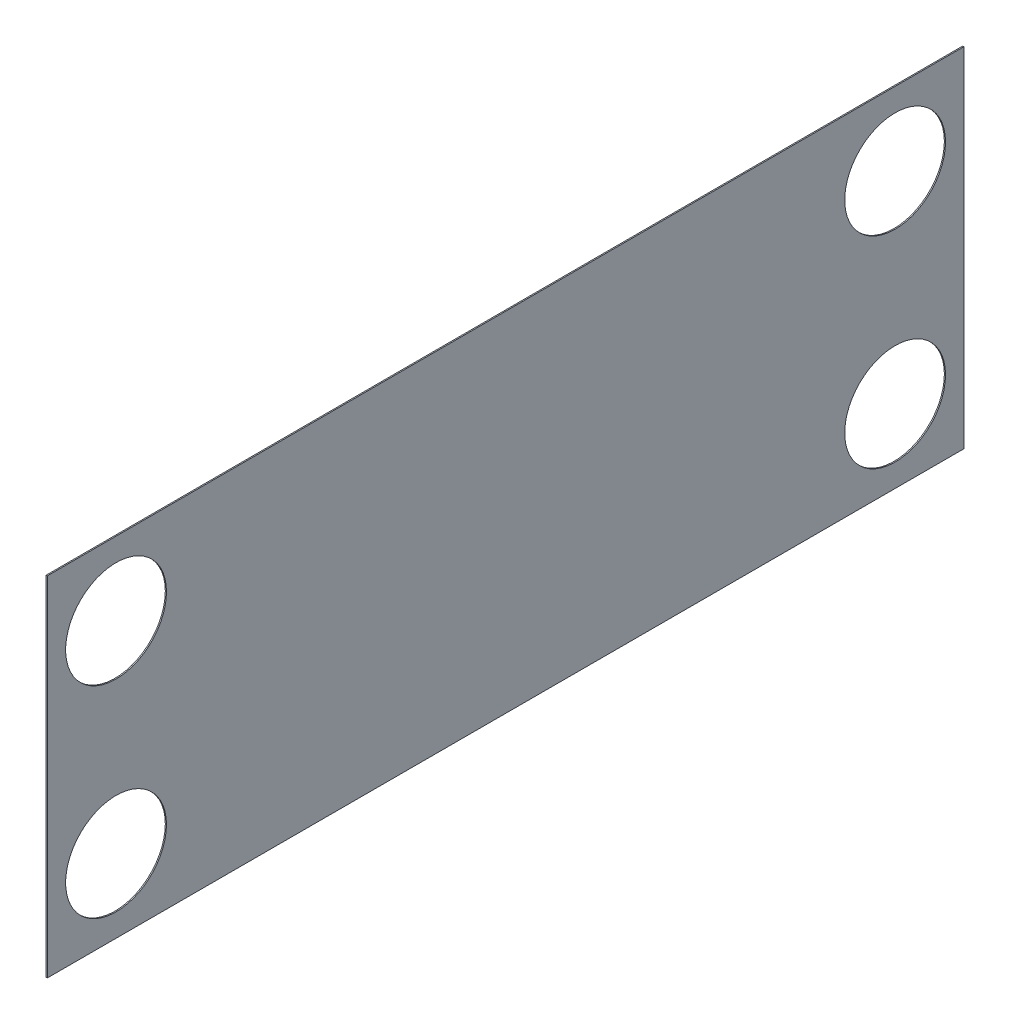
ISO-10303-21;
HEADER;
FILE_DESCRIPTION(('STEP AP214'),'2;1');
FILE_NAME('part.step','',(''),(''),'','','');
FILE_SCHEMA(('AUTOMOTIVE_DESIGN { 1 0 10303 214 1 1 1 1 }'));
ENDSEC;
DATA;
#1=APPLICATION_CONTEXT('core data for automotive mechanical design processes');
#2=APPLICATION_PROTOCOL_DEFINITION('international standard','automotive_design',2000,#1);
#3=PRODUCT_CONTEXT('',#1,'mechanical');
#4=PRODUCT('Part','Part','',(#3));
#5=PRODUCT_RELATED_PRODUCT_CATEGORY('part','',(#4));
#6=PRODUCT_DEFINITION_FORMATION('','',#4);
#7=PRODUCT_DEFINITION_CONTEXT('part definition',#1,'design');
#8=PRODUCT_DEFINITION('design','',#6,#7);
#9=PRODUCT_DEFINITION_SHAPE('','',#8);
#10=(LENGTH_UNIT() NAMED_UNIT(*) SI_UNIT(.MILLI.,.METRE.));
#11=(NAMED_UNIT(*) PLANE_ANGLE_UNIT() SI_UNIT($,.RADIAN.));
#12=(NAMED_UNIT(*) SI_UNIT($,.STERADIAN.) SOLID_ANGLE_UNIT());
#13=UNCERTAINTY_MEASURE_WITH_UNIT(LENGTH_MEASURE(1.E-05),#10,'distance_accuracy_value','');
#14=(GEOMETRIC_REPRESENTATION_CONTEXT(3) GLOBAL_UNCERTAINTY_ASSIGNED_CONTEXT((#13)) GLOBAL_UNIT_ASSIGNED_CONTEXT((#10,
#11,#12)) REPRESENTATION_CONTEXT('',''));
#15=CARTESIAN_POINT('',(0.,0.,0.));
#16=DIRECTION('',(0.,0.,1.));
#17=DIRECTION('',(1.,0.,0.));
#18=AXIS2_PLACEMENT_3D('',#15,#16,#17);
#19=CARTESIAN_POINT('',(0.127,19.,50.));
#20=DIRECTION('',(0.,0.,-1.));
#21=DIRECTION('',(-1.,0.,0.));
#22=AXIS2_PLACEMENT_3D('',#19,#20,#21);
#23=PLANE('',#22);
#24=DIRECTION('',(0.,-1.,0.));
#25=VECTOR('',#24,1.);
#26=CARTESIAN_POINT('',(0.,19.,50.));
#27=LINE('',#26,#25);
#28=CARTESIAN_POINT('',(0.,19.,50.));
#29=VERTEX_POINT('',#28);
#30=CARTESIAN_POINT('',(0.,-19.,50.));
#31=VERTEX_POINT('',#30);
#32=EDGE_CURVE('E97',#29,#31,#27,.T.);
#33=ORIENTED_EDGE('',*,*,#32,.T.);
#34=DIRECTION('',(-1.,0.,0.));
#35=VECTOR('',#34,1.);
#36=CARTESIAN_POINT('',(0.127,-19.,50.));
#37=LINE('',#36,#35);
#38=CARTESIAN_POINT('',(0.127,-19.,50.));
#39=VERTEX_POINT('',#38);
#40=EDGE_CURVE('E11',#39,#31,#37,.T.);
#41=ORIENTED_EDGE('',*,*,#40,.F.);
#42=DIRECTION('',(0.,-1.,0.));
#43=VECTOR('',#42,1.);
#44=CARTESIAN_POINT('',(0.127,19.,50.));
#45=LINE('',#44,#43);
#46=CARTESIAN_POINT('',(0.127,19.,50.));
#47=VERTEX_POINT('',#46);
#48=EDGE_CURVE('E85',#47,#39,#45,.T.);
#49=ORIENTED_EDGE('',*,*,#48,.F.);
#50=DIRECTION('',(-1.,0.,0.));
#51=VECTOR('',#50,1.);
#52=CARTESIAN_POINT('',(0.127,19.,50.));
#53=LINE('',#52,#51);
#54=EDGE_CURVE('E93',#47,#29,#53,.T.);
#55=ORIENTED_EDGE('',*,*,#54,.T.);
#56=EDGE_LOOP('',(#33,#41,#49,#55));
#57=FACE_BOUND('',#56,.T.);
#58=ADVANCED_FACE('F34',(#57),#23,.F.);
#59=CARTESIAN_POINT('',(0.127,-19.,50.));
#60=DIRECTION('',(0.,1.,0.));
#61=DIRECTION('',(0.,0.,1.));
#62=AXIS2_PLACEMENT_3D('',#59,#60,#61);
#63=PLANE('',#62);
#64=DIRECTION('',(0.,0.,-1.));
#65=VECTOR('',#64,1.);
#66=CARTESIAN_POINT('',(0.,-19.,50.));
#67=LINE('',#66,#65);
#68=CARTESIAN_POINT('',(0.,-19.,-50.));
#69=VERTEX_POINT('',#68);
#70=EDGE_CURVE('E89',#31,#69,#67,.T.);
#71=ORIENTED_EDGE('',*,*,#70,.T.);
#72=DIRECTION('',(-1.,0.,0.));
#73=VECTOR('',#72,1.);
#74=CARTESIAN_POINT('',(0.127,-19.,-50.));
#75=LINE('',#74,#73);
#76=CARTESIAN_POINT('',(0.127,-19.,-50.));
#77=VERTEX_POINT('',#76);
#78=EDGE_CURVE('E42',#77,#69,#75,.T.);
#79=ORIENTED_EDGE('',*,*,#78,.F.);
#80=DIRECTION('',(0.,0.,-1.));
#81=VECTOR('',#80,1.);
#82=CARTESIAN_POINT('',(0.127,-19.,50.));
#83=LINE('',#82,#81);
#84=EDGE_CURVE('E80',#39,#77,#83,.T.);
#85=ORIENTED_EDGE('',*,*,#84,.F.);
#86=ORIENTED_EDGE('',*,*,#40,.T.);
#87=EDGE_LOOP('',(#71,#79,#85,#86));
#88=FACE_BOUND('',#87,.T.);
#89=ADVANCED_FACE('F88',(#88),#63,.F.);
#90=CARTESIAN_POINT('',(0.127,19.,-50.));
#91=DIRECTION('',(0.,0.,1.));
#92=DIRECTION('',(1.,0.,0.));
#93=AXIS2_PLACEMENT_3D('',#90,#91,#92);
#94=PLANE('',#93);
#95=DIRECTION('',(0.,1.,0.));
#96=VECTOR('',#95,1.);
#97=CARTESIAN_POINT('',(0.,19.,-50.));
#98=LINE('',#97,#96);
#99=CARTESIAN_POINT('',(0.,19.,-50.));
#100=VERTEX_POINT('',#99);
#101=EDGE_CURVE('E67',#69,#100,#98,.T.);
#102=ORIENTED_EDGE('',*,*,#101,.T.);
#103=DIRECTION('',(-1.,0.,0.));
#104=VECTOR('',#103,1.);
#105=CARTESIAN_POINT('',(0.127,19.,-50.));
#106=LINE('',#105,#104);
#107=CARTESIAN_POINT('',(0.127,19.,-50.));
#108=VERTEX_POINT('',#107);
#109=EDGE_CURVE('E90',#108,#100,#106,.T.);
#110=ORIENTED_EDGE('',*,*,#109,.F.);
#111=DIRECTION('',(0.,1.,0.));
#112=VECTOR('',#111,1.);
#113=CARTESIAN_POINT('',(0.127,19.,-50.));
#114=LINE('',#113,#112);
#115=EDGE_CURVE('E83',#77,#108,#114,.T.);
#116=ORIENTED_EDGE('',*,*,#115,.F.);
#117=ORIENTED_EDGE('',*,*,#78,.T.);
#118=EDGE_LOOP('',(#102,#110,#116,#117));
#119=FACE_BOUND('',#118,.T.);
#120=ADVANCED_FACE('F91',(#119),#94,.F.);
#121=CARTESIAN_POINT('',(0.127,19.,50.));
#122=DIRECTION('',(0.,-1.,0.));
#123=DIRECTION('',(0.,0.,-1.));
#124=AXIS2_PLACEMENT_3D('',#121,#122,#123);
#125=PLANE('',#124);
#126=DIRECTION('',(0.,0.,1.));
#127=VECTOR('',#126,1.);
#128=CARTESIAN_POINT('',(0.,19.,50.));
#129=LINE('',#128,#127);
#130=EDGE_CURVE('E73',#100,#29,#129,.T.);
#131=ORIENTED_EDGE('',*,*,#130,.T.);
#132=ORIENTED_EDGE('',*,*,#54,.F.);
#133=DIRECTION('',(0.,0.,1.));
#134=VECTOR('',#133,1.);
#135=CARTESIAN_POINT('',(0.127,19.,50.));
#136=LINE('',#135,#134);
#137=EDGE_CURVE('E50',#108,#47,#136,.T.);
#138=ORIENTED_EDGE('',*,*,#137,.F.);
#139=ORIENTED_EDGE('',*,*,#109,.T.);
#140=EDGE_LOOP('',(#131,#132,#138,#139));
#141=FACE_BOUND('',#140,.T.);
#142=ADVANCED_FACE('F105',(#141),#125,.F.);
#143=CARTESIAN_POINT('',(0.127,0.,0.));
#144=DIRECTION('',(1.,0.,0.));
#145=DIRECTION('',(0.,0.,-1.));
#146=AXIS2_PLACEMENT_3D('',#143,#144,#145);
#147=PLANE('',#146);
#148=CARTESIAN_POINT('',(0.127000000000001,11.,42.5));
#149=DIRECTION('',(1.,0.,0.));
#150=DIRECTION('',(0.,0.,-1.));
#151=AXIS2_PLACEMENT_3D('',#148,#149,#150);
#152=CIRCLE('',#151,5.49999999999999);
#153=CARTESIAN_POINT('',(0.127000000000001,11.,37.));
#154=VERTEX_POINT('',#153);
#155=EDGE_CURVE('E131',#154,#154,#152,.T.);
#156=ORIENTED_EDGE('',*,*,#155,.F.);
#157=EDGE_LOOP('',(#156));
#158=FACE_BOUND('',#157,.T.);
#159=CARTESIAN_POINT('',(0.127000000000001,-11.,42.5));
#160=DIRECTION('',(1.,0.,0.));
#161=DIRECTION('',(0.,0.,-1.));
#162=AXIS2_PLACEMENT_3D('',#159,#160,#161);
#163=CIRCLE('',#162,5.49999999999999);
#164=CARTESIAN_POINT('',(0.127000000000001,-11.,37.));
#165=VERTEX_POINT('',#164);
#166=EDGE_CURVE('E125',#165,#165,#163,.T.);
#167=ORIENTED_EDGE('',*,*,#166,.F.);
#168=EDGE_LOOP('',(#167));
#169=FACE_BOUND('',#168,.T.);
#170=CARTESIAN_POINT('',(0.127000000000001,11.,-42.5));
#171=DIRECTION('',(1.,0.,0.));
#172=DIRECTION('',(0.,0.,-1.));
#173=AXIS2_PLACEMENT_3D('',#170,#171,#172);
#174=CIRCLE('',#173,5.49999999999999);
#175=CARTESIAN_POINT('',(0.127000000000001,11.,-48.));
#176=VERTEX_POINT('',#175);
#177=EDGE_CURVE('E119',#176,#176,#174,.T.);
#178=ORIENTED_EDGE('',*,*,#177,.F.);
#179=EDGE_LOOP('',(#178));
#180=FACE_BOUND('',#179,.T.);
#181=CARTESIAN_POINT('',(0.127000000000001,-11.,-42.5));
#182=DIRECTION('',(1.,0.,0.));
#183=DIRECTION('',(0.,0.,-1.));
#184=AXIS2_PLACEMENT_3D('',#181,#182,#183);
#185=CIRCLE('',#184,5.49999999999999);
#186=CARTESIAN_POINT('',(0.127000000000001,-11.,-48.));
#187=VERTEX_POINT('',#186);
#188=EDGE_CURVE('E113',#187,#187,#185,.T.);
#189=ORIENTED_EDGE('',*,*,#188,.F.);
#190=EDGE_LOOP('',(#189));
#191=FACE_BOUND('',#190,.T.);
#192=ORIENTED_EDGE('',*,*,#48,.T.);
#193=ORIENTED_EDGE('',*,*,#84,.T.);
#194=ORIENTED_EDGE('',*,*,#115,.T.);
#195=ORIENTED_EDGE('',*,*,#137,.T.);
#196=EDGE_LOOP('',(#192,#193,#194,#195));
#197=FACE_BOUND('',#196,.T.);
#198=ADVANCED_FACE('F81',(#158,#169,#180,#191,#197),#147,.T.);
#199=CARTESIAN_POINT('',(0.,0.,0.));
#200=DIRECTION('',(1.,0.,0.));
#201=DIRECTION('',(0.,0.,-1.));
#202=AXIS2_PLACEMENT_3D('',#199,#200,#201);
#203=PLANE('',#202);
#204=CARTESIAN_POINT('',(0.,11.,42.5));
#205=DIRECTION('',(1.,0.,0.));
#206=DIRECTION('',(0.,0.,-1.));
#207=AXIS2_PLACEMENT_3D('',#204,#205,#206);
#208=CIRCLE('',#207,5.5);
#209=CARTESIAN_POINT('',(0.,11.,37.));
#210=VERTEX_POINT('',#209);
#211=EDGE_CURVE('E128',#210,#210,#208,.T.);
#212=ORIENTED_EDGE('',*,*,#211,.T.);
#213=EDGE_LOOP('',(#212));
#214=FACE_BOUND('',#213,.T.);
#215=CARTESIAN_POINT('',(0.,-11.,42.5));
#216=DIRECTION('',(1.,0.,0.));
#217=DIRECTION('',(0.,0.,-1.));
#218=AXIS2_PLACEMENT_3D('',#215,#216,#217);
#219=CIRCLE('',#218,5.5);
#220=CARTESIAN_POINT('',(0.,-11.,37.));
#221=VERTEX_POINT('',#220);
#222=EDGE_CURVE('E122',#221,#221,#219,.T.);
#223=ORIENTED_EDGE('',*,*,#222,.T.);
#224=EDGE_LOOP('',(#223));
#225=FACE_BOUND('',#224,.T.);
#226=CARTESIAN_POINT('',(0.,11.,-42.5));
#227=DIRECTION('',(1.,0.,0.));
#228=DIRECTION('',(0.,0.,-1.));
#229=AXIS2_PLACEMENT_3D('',#226,#227,#228);
#230=CIRCLE('',#229,5.5);
#231=CARTESIAN_POINT('',(0.,11.,-48.));
#232=VERTEX_POINT('',#231);
#233=EDGE_CURVE('E116',#232,#232,#230,.T.);
#234=ORIENTED_EDGE('',*,*,#233,.T.);
#235=EDGE_LOOP('',(#234));
#236=FACE_BOUND('',#235,.T.);
#237=CARTESIAN_POINT('',(0.,-11.,-42.5));
#238=DIRECTION('',(1.,0.,0.));
#239=DIRECTION('',(0.,0.,-1.));
#240=AXIS2_PLACEMENT_3D('',#237,#238,#239);
#241=CIRCLE('',#240,5.5);
#242=CARTESIAN_POINT('',(0.,-11.,-48.));
#243=VERTEX_POINT('',#242);
#244=EDGE_CURVE('E100',#243,#243,#241,.T.);
#245=ORIENTED_EDGE('',*,*,#244,.T.);
#246=EDGE_LOOP('',(#245));
#247=FACE_BOUND('',#246,.T.);
#248=ORIENTED_EDGE('',*,*,#32,.F.);
#249=ORIENTED_EDGE('',*,*,#130,.F.);
#250=ORIENTED_EDGE('',*,*,#101,.F.);
#251=ORIENTED_EDGE('',*,*,#70,.F.);
#252=EDGE_LOOP('',(#248,#249,#250,#251));
#253=FACE_BOUND('',#252,.T.);
#254=ADVANCED_FACE('F108',(#214,#225,#236,#247,#253),#203,.F.);
#255=CARTESIAN_POINT('',(0.127,-11.,-42.5));
#256=DIRECTION('',(1.,0.,0.));
#257=DIRECTION('',(0.,0.,-1.));
#258=AXIS2_PLACEMENT_3D('',#255,#256,#257);
#259=CYLINDRICAL_SURFACE('',#258,5.49999999999999);
#260=ORIENTED_EDGE('',*,*,#244,.F.);
#261=EDGE_LOOP('',(#260));
#262=FACE_BOUND('',#261,.T.);
#263=ORIENTED_EDGE('',*,*,#188,.T.);
#264=EDGE_LOOP('',(#263));
#265=FACE_BOUND('',#264,.T.);
#266=ADVANCED_FACE('F146',(#262,#265),#259,.F.);
#267=CARTESIAN_POINT('',(0.127,11.,-42.5));
#268=DIRECTION('',(1.,0.,0.));
#269=DIRECTION('',(0.,0.,-1.));
#270=AXIS2_PLACEMENT_3D('',#267,#268,#269);
#271=CYLINDRICAL_SURFACE('',#270,5.49999999999999);
#272=ORIENTED_EDGE('',*,*,#233,.F.);
#273=EDGE_LOOP('',(#272));
#274=FACE_BOUND('',#273,.T.);
#275=ORIENTED_EDGE('',*,*,#177,.T.);
#276=EDGE_LOOP('',(#275));
#277=FACE_BOUND('',#276,.T.);
#278=ADVANCED_FACE('F148',(#274,#277),#271,.F.);
#279=CARTESIAN_POINT('',(0.127,-11.,42.5));
#280=DIRECTION('',(1.,0.,0.));
#281=DIRECTION('',(0.,0.,-1.));
#282=AXIS2_PLACEMENT_3D('',#279,#280,#281);
#283=CYLINDRICAL_SURFACE('',#282,5.49999999999999);
#284=ORIENTED_EDGE('',*,*,#222,.F.);
#285=EDGE_LOOP('',(#284));
#286=FACE_BOUND('',#285,.T.);
#287=ORIENTED_EDGE('',*,*,#166,.T.);
#288=EDGE_LOOP('',(#287));
#289=FACE_BOUND('',#288,.T.);
#290=ADVANCED_FACE('F155',(#286,#289),#283,.F.);
#291=CARTESIAN_POINT('',(0.127,11.,42.5));
#292=DIRECTION('',(1.,0.,0.));
#293=DIRECTION('',(0.,0.,-1.));
#294=AXIS2_PLACEMENT_3D('',#291,#292,#293);
#295=CYLINDRICAL_SURFACE('',#294,5.49999999999999);
#296=ORIENTED_EDGE('',*,*,#211,.F.);
#297=EDGE_LOOP('',(#296));
#298=FACE_BOUND('',#297,.T.);
#299=ORIENTED_EDGE('',*,*,#155,.T.);
#300=EDGE_LOOP('',(#299));
#301=FACE_BOUND('',#300,.T.);
#302=ADVANCED_FACE('F135',(#298,#301),#295,.F.);
#303=CLOSED_SHELL('',(#58,#89,#120,#142,#198,#254,#266,#278,#290,#302));
#304=MANIFOLD_SOLID_BREP('B2',#303);
#305=ADVANCED_BREP_SHAPE_REPRESENTATION('',(#18,#304),#14);
#306=SHAPE_DEFINITION_REPRESENTATION(#9,#305);
ENDSEC;
END-ISO-10303-21;
